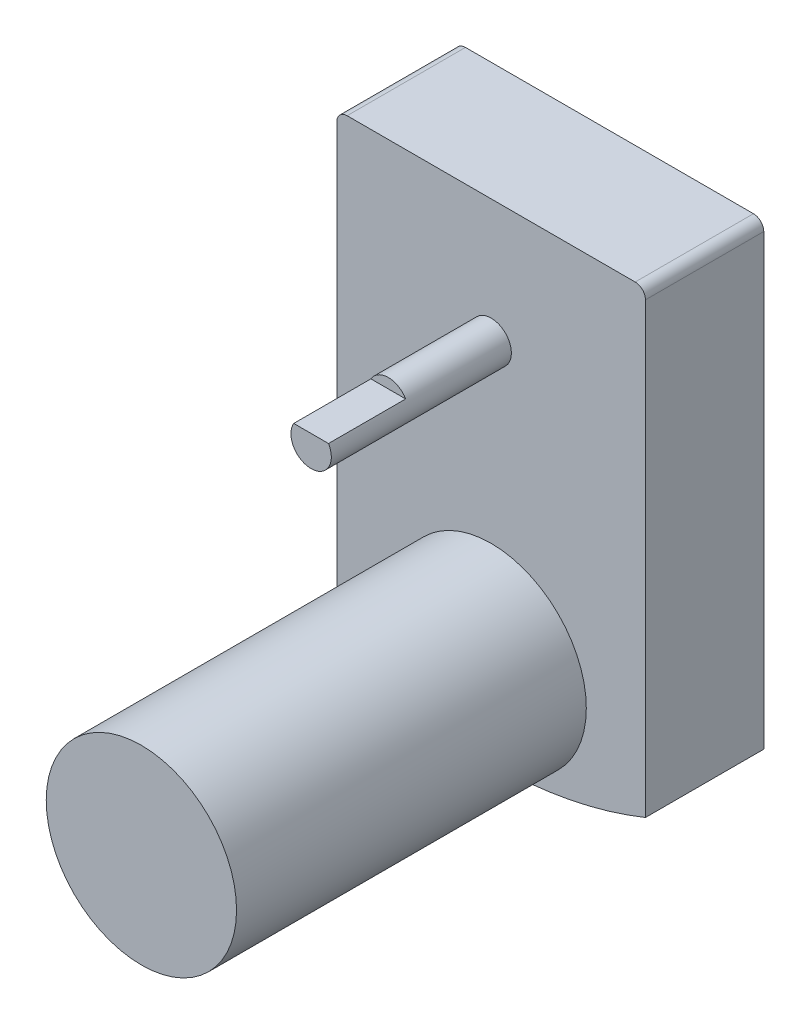
ISO-10303-21;
HEADER;
FILE_DESCRIPTION(('STEP AP214'),'2;1');
FILE_NAME('part.step','',(''),(''),'','','');
FILE_SCHEMA(('AUTOMOTIVE_DESIGN { 1 0 10303 214 1 1 1 1 }'));
ENDSEC;
DATA;
#1=APPLICATION_CONTEXT('core data for automotive mechanical design processes');
#2=APPLICATION_PROTOCOL_DEFINITION('international standard','automotive_design',2000,#1);
#3=PRODUCT_CONTEXT('',#1,'mechanical');
#4=PRODUCT('Part','Part','',(#3));
#5=PRODUCT_RELATED_PRODUCT_CATEGORY('part','',(#4));
#6=PRODUCT_DEFINITION_FORMATION('','',#4);
#7=PRODUCT_DEFINITION_CONTEXT('part definition',#1,'design');
#8=PRODUCT_DEFINITION('design','',#6,#7);
#9=PRODUCT_DEFINITION_SHAPE('','',#8);
#10=(LENGTH_UNIT() NAMED_UNIT(*) SI_UNIT(.MILLI.,.METRE.));
#11=(NAMED_UNIT(*) PLANE_ANGLE_UNIT() SI_UNIT($,.RADIAN.));
#12=(NAMED_UNIT(*) SI_UNIT($,.STERADIAN.) SOLID_ANGLE_UNIT());
#13=UNCERTAINTY_MEASURE_WITH_UNIT(LENGTH_MEASURE(1.E-05),#10,'distance_accuracy_value','');
#14=(GEOMETRIC_REPRESENTATION_CONTEXT(3) GLOBAL_UNCERTAINTY_ASSIGNED_CONTEXT((#13)) GLOBAL_UNIT_ASSIGNED_CONTEXT((#10,
#11,#12)) REPRESENTATION_CONTEXT('',''));
#15=CARTESIAN_POINT('',(0.,0.,0.));
#16=DIRECTION('',(0.,0.,1.));
#17=DIRECTION('',(1.,0.,0.));
#18=AXIS2_PLACEMENT_3D('',#15,#16,#17);
#19=CARTESIAN_POINT('',(0.,0.,23.));
#20=DIRECTION('',(0.,0.,1.));
#21=DIRECTION('',(1.,0.,0.));
#22=AXIS2_PLACEMENT_3D('',#19,#20,#21);
#23=PLANE('',#22);
#24=CARTESIAN_POINT('',(0.,23.5,23.));
#25=DIRECTION('',(0.,0.,1.));
#26=DIRECTION('',(1.,0.,0.));
#27=AXIS2_PLACEMENT_3D('',#24,#25,#26);
#28=CIRCLE('',#27,3.92796839095987);
#29=CARTESIAN_POINT('',(3.92796839095987,23.5,23.));
#30=VERTEX_POINT('',#29);
#31=EDGE_CURVE('E251',#30,#30,#28,.T.);
#32=ORIENTED_EDGE('',*,*,#31,.F.);
#33=EDGE_LOOP('',(#32));
#34=FACE_BOUND('',#33,.T.);
#35=CARTESIAN_POINT('',(0.,32.5,23.));
#36=DIRECTION('',(0.,0.,1.));
#37=DIRECTION('',(1.,0.,0.));
#38=AXIS2_PLACEMENT_3D('',#35,#36,#37);
#39=CIRCLE('',#38,80.);
#40=CARTESIAN_POINT('',(30.,-41.6619848709566,23.));
#41=VERTEX_POINT('',#40);
#42=CARTESIAN_POINT('',(0.,-47.5,23.));
#43=VERTEX_POINT('',#42);
#44=EDGE_CURVE('E121',#41,#43,#39,.F.);
#45=ORIENTED_EDGE('',*,*,#44,.F.);
#46=DIRECTION('',(0.,1.,0.));
#47=VECTOR('',#46,1.);
#48=CARTESIAN_POINT('',(30.,47.5,23.));
#49=LINE('',#48,#47);
#50=CARTESIAN_POINT('',(30.,45.5,23.));
#51=VERTEX_POINT('',#50);
#52=EDGE_CURVE('E66',#41,#51,#49,.T.);
#53=ORIENTED_EDGE('',*,*,#52,.T.);
#54=CARTESIAN_POINT('',(28.,45.5,23.));
#55=DIRECTION('',(0.,0.,1.));
#56=DIRECTION('',(1.,0.,0.));
#57=AXIS2_PLACEMENT_3D('',#54,#55,#56);
#58=CIRCLE('',#57,2.);
#59=CARTESIAN_POINT('',(28.,47.5,23.));
#60=VERTEX_POINT('',#59);
#61=EDGE_CURVE('E52',#51,#60,#58,.T.);
#62=ORIENTED_EDGE('',*,*,#61,.T.);
#63=DIRECTION('',(-1.,0.,0.));
#64=VECTOR('',#63,1.);
#65=CARTESIAN_POINT('',(-30.,47.5,23.));
#66=LINE('',#65,#64);
#67=CARTESIAN_POINT('',(-28.,47.5,23.));
#68=VERTEX_POINT('',#67);
#69=EDGE_CURVE('E133',#60,#68,#66,.T.);
#70=ORIENTED_EDGE('',*,*,#69,.T.);
#71=CARTESIAN_POINT('',(-28.,45.5,23.));
#72=DIRECTION('',(0.,0.,1.));
#73=DIRECTION('',(1.,0.,0.));
#74=AXIS2_PLACEMENT_3D('',#71,#72,#73);
#75=CIRCLE('',#74,2.);
#76=CARTESIAN_POINT('',(-30.,45.5,23.));
#77=VERTEX_POINT('',#76);
#78=EDGE_CURVE('E130',#68,#77,#75,.T.);
#79=ORIENTED_EDGE('',*,*,#78,.T.);
#80=DIRECTION('',(0.,-1.,0.));
#81=VECTOR('',#80,1.);
#82=CARTESIAN_POINT('',(-30.,47.5,23.));
#83=LINE('',#82,#81);
#84=CARTESIAN_POINT('',(-30.,-41.6619848709566,23.));
#85=VERTEX_POINT('',#84);
#86=EDGE_CURVE('E115',#77,#85,#83,.T.);
#87=ORIENTED_EDGE('',*,*,#86,.T.);
#88=EDGE_CURVE('E124',#43,#85,#39,.F.);
#89=ORIENTED_EDGE('',*,*,#88,.F.);
#90=CARTESIAN_POINT('',(0.,-29.,23.));
#91=DIRECTION('',(0.,0.,1.));
#92=DIRECTION('',(1.,0.,0.));
#93=AXIS2_PLACEMENT_3D('',#90,#91,#92);
#94=CIRCLE('',#93,18.5);
#95=EDGE_CURVE('E243',#43,#43,#94,.T.);
#96=ORIENTED_EDGE('',*,*,#95,.F.);
#97=EDGE_LOOP('',(#45,#53,#62,#70,#79,#87,#89,#96));
#98=FACE_BOUND('',#97,.T.);
#99=ADVANCED_FACE('F43',(#34,#98),#23,.T.);
#100=CARTESIAN_POINT('',(0.,0.,0.));
#101=DIRECTION('',(0.,0.,1.));
#102=DIRECTION('',(1.,0.,0.));
#103=AXIS2_PLACEMENT_3D('',#100,#101,#102);
#104=PLANE('',#103);
#105=CARTESIAN_POINT('',(19.9999999999996,-16.5,0.));
#106=DIRECTION('',(0.,0.,1.));
#107=DIRECTION('',(1.,0.,0.));
#108=AXIS2_PLACEMENT_3D('',#105,#106,#107);
#109=CIRCLE('',#108,4.);
#110=CARTESIAN_POINT('',(23.9999999999996,-16.5,0.));
#111=VERTEX_POINT('',#110);
#112=EDGE_CURVE('E166',#111,#111,#109,.F.);
#113=ORIENTED_EDGE('',*,*,#112,.F.);
#114=EDGE_LOOP('',(#113));
#115=FACE_BOUND('',#114,.T.);
#116=CARTESIAN_POINT('',(-20.0000000000004,-16.5,0.));
#117=DIRECTION('',(0.,0.,1.));
#118=DIRECTION('',(1.,0.,0.));
#119=AXIS2_PLACEMENT_3D('',#116,#117,#118);
#120=CIRCLE('',#119,4.);
#121=CARTESIAN_POINT('',(-16.0000000000004,-16.5,0.));
#122=VERTEX_POINT('',#121);
#123=EDGE_CURVE('E162',#122,#122,#120,.F.);
#124=ORIENTED_EDGE('',*,*,#123,.F.);
#125=EDGE_LOOP('',(#124));
#126=FACE_BOUND('',#125,.T.);
#127=CARTESIAN_POINT('',(20.,23.5,0.));
#128=DIRECTION('',(0.,0.,1.));
#129=DIRECTION('',(1.,0.,0.));
#130=AXIS2_PLACEMENT_3D('',#127,#128,#129);
#131=CIRCLE('',#130,4.);
#132=CARTESIAN_POINT('',(24.,23.5,0.));
#133=VERTEX_POINT('',#132);
#134=EDGE_CURVE('E158',#133,#133,#131,.F.);
#135=ORIENTED_EDGE('',*,*,#134,.F.);
#136=EDGE_LOOP('',(#135));
#137=FACE_BOUND('',#136,.T.);
#138=CARTESIAN_POINT('',(-20.,23.5,0.));
#139=DIRECTION('',(0.,0.,1.));
#140=DIRECTION('',(1.,0.,0.));
#141=AXIS2_PLACEMENT_3D('',#138,#139,#140);
#142=CIRCLE('',#141,4.);
#143=CARTESIAN_POINT('',(-16.,23.5,0.));
#144=VERTEX_POINT('',#143);
#145=EDGE_CURVE('E154',#144,#144,#142,.F.);
#146=ORIENTED_EDGE('',*,*,#145,.F.);
#147=EDGE_LOOP('',(#146));
#148=FACE_BOUND('',#147,.T.);
#149=DIRECTION('',(0.,1.,0.));
#150=VECTOR('',#149,1.);
#151=CARTESIAN_POINT('',(30.,47.5,0.));
#152=LINE('',#151,#150);
#153=CARTESIAN_POINT('',(30.,-41.6619848709566,0.));
#154=VERTEX_POINT('',#153);
#155=CARTESIAN_POINT('',(30.,45.5,0.));
#156=VERTEX_POINT('',#155);
#157=EDGE_CURVE('E142',#154,#156,#152,.T.);
#158=ORIENTED_EDGE('',*,*,#157,.F.);
#159=CARTESIAN_POINT('',(0.,32.5,0.));
#160=DIRECTION('',(0.,0.,1.));
#161=DIRECTION('',(1.,0.,0.));
#162=AXIS2_PLACEMENT_3D('',#159,#160,#161);
#163=CIRCLE('',#162,80.);
#164=CARTESIAN_POINT('',(-30.,-41.6619848709566,0.));
#165=VERTEX_POINT('',#164);
#166=EDGE_CURVE('E11',#154,#165,#163,.F.);
#167=ORIENTED_EDGE('',*,*,#166,.T.);
#168=DIRECTION('',(0.,-1.,0.));
#169=VECTOR('',#168,1.);
#170=CARTESIAN_POINT('',(-30.,47.5,0.));
#171=LINE('',#170,#169);
#172=CARTESIAN_POINT('',(-30.,45.5,0.));
#173=VERTEX_POINT('',#172);
#174=EDGE_CURVE('E118',#173,#165,#171,.T.);
#175=ORIENTED_EDGE('',*,*,#174,.F.);
#176=CARTESIAN_POINT('',(-28.,45.5,0.));
#177=DIRECTION('',(0.,0.,1.));
#178=DIRECTION('',(1.,0.,0.));
#179=AXIS2_PLACEMENT_3D('',#176,#177,#178);
#180=CIRCLE('',#179,2.);
#181=CARTESIAN_POINT('',(-28.,47.5,0.));
#182=VERTEX_POINT('',#181);
#183=EDGE_CURVE('E173',#173,#182,#180,.F.);
#184=ORIENTED_EDGE('',*,*,#183,.T.);
#185=DIRECTION('',(-1.,0.,0.));
#186=VECTOR('',#185,1.);
#187=CARTESIAN_POINT('',(-30.,47.5,0.));
#188=LINE('',#187,#186);
#189=CARTESIAN_POINT('',(28.,47.5,0.));
#190=VERTEX_POINT('',#189);
#191=EDGE_CURVE('E145',#190,#182,#188,.T.);
#192=ORIENTED_EDGE('',*,*,#191,.F.);
#193=CARTESIAN_POINT('',(28.,45.5,0.));
#194=DIRECTION('',(0.,0.,1.));
#195=DIRECTION('',(1.,0.,0.));
#196=AXIS2_PLACEMENT_3D('',#193,#194,#195);
#197=CIRCLE('',#196,2.);
#198=EDGE_CURVE('E187',#190,#156,#197,.F.);
#199=ORIENTED_EDGE('',*,*,#198,.T.);
#200=EDGE_LOOP('',(#158,#167,#175,#184,#192,#199));
#201=FACE_BOUND('',#200,.T.);
#202=ADVANCED_FACE('F205',(#115,#126,#137,#148,#201),#104,.F.);
#203=CARTESIAN_POINT('',(30.,47.5,23.));
#204=DIRECTION('',(-1.,0.,0.));
#205=DIRECTION('',(0.,-1.,0.));
#206=AXIS2_PLACEMENT_3D('',#203,#204,#205);
#207=PLANE('',#206);
#208=ORIENTED_EDGE('',*,*,#52,.F.);
#209=DIRECTION('',(0.,0.,-1.));
#210=VECTOR('',#209,1.);
#211=CARTESIAN_POINT('',(30.,-41.6619848709566,18.));
#212=LINE('',#211,#210);
#213=EDGE_CURVE('E120',#41,#154,#212,.T.);
#214=ORIENTED_EDGE('',*,*,#213,.T.);
#215=ORIENTED_EDGE('',*,*,#157,.T.);
#216=DIRECTION('',(0.,0.,-1.));
#217=VECTOR('',#216,1.);
#218=CARTESIAN_POINT('',(30.,45.5,23.));
#219=LINE('',#218,#217);
#220=EDGE_CURVE('E191',#156,#51,#219,.F.);
#221=ORIENTED_EDGE('',*,*,#220,.T.);
#222=EDGE_LOOP('',(#208,#214,#215,#221));
#223=FACE_BOUND('',#222,.T.);
#224=ADVANCED_FACE('F225',(#223),#207,.F.);
#225=CARTESIAN_POINT('',(-30.,47.5,23.));
#226=DIRECTION('',(0.,-1.,0.));
#227=DIRECTION('',(0.,0.,-1.));
#228=AXIS2_PLACEMENT_3D('',#225,#226,#227);
#229=PLANE('',#228);
#230=ORIENTED_EDGE('',*,*,#69,.F.);
#231=DIRECTION('',(0.,0.,-1.));
#232=VECTOR('',#231,1.);
#233=CARTESIAN_POINT('',(28.,47.5,23.));
#234=LINE('',#233,#232);
#235=EDGE_CURVE('E183',#60,#190,#234,.T.);
#236=ORIENTED_EDGE('',*,*,#235,.T.);
#237=ORIENTED_EDGE('',*,*,#191,.T.);
#238=DIRECTION('',(0.,0.,-1.));
#239=VECTOR('',#238,1.);
#240=CARTESIAN_POINT('',(-28.,47.5,23.));
#241=LINE('',#240,#239);
#242=EDGE_CURVE('E177',#182,#68,#241,.F.);
#243=ORIENTED_EDGE('',*,*,#242,.T.);
#244=EDGE_LOOP('',(#230,#236,#237,#243));
#245=FACE_BOUND('',#244,.T.);
#246=ADVANCED_FACE('F200',(#245),#229,.F.);
#247=CARTESIAN_POINT('',(-30.,47.5,23.));
#248=DIRECTION('',(1.,0.,0.));
#249=DIRECTION('',(0.,1.,0.));
#250=AXIS2_PLACEMENT_3D('',#247,#248,#249);
#251=PLANE('',#250);
#252=DIRECTION('',(0.,0.,-1.));
#253=VECTOR('',#252,1.);
#254=CARTESIAN_POINT('',(-30.,-41.6619848709566,18.));
#255=LINE('',#254,#253);
#256=EDGE_CURVE('E59',#165,#85,#255,.F.);
#257=ORIENTED_EDGE('',*,*,#256,.T.);
#258=ORIENTED_EDGE('',*,*,#86,.F.);
#259=DIRECTION('',(0.,0.,-1.));
#260=VECTOR('',#259,1.);
#261=CARTESIAN_POINT('',(-30.,45.5,23.));
#262=LINE('',#261,#260);
#263=EDGE_CURVE('E170',#77,#173,#262,.T.);
#264=ORIENTED_EDGE('',*,*,#263,.T.);
#265=ORIENTED_EDGE('',*,*,#174,.T.);
#266=EDGE_LOOP('',(#257,#258,#264,#265));
#267=FACE_BOUND('',#266,.T.);
#268=ADVANCED_FACE('F112',(#267),#251,.F.);
#269=CARTESIAN_POINT('',(0.,-29.,91.));
#270=DIRECTION('',(0.,0.,-1.));
#271=DIRECTION('',(-1.,0.,0.));
#272=AXIS2_PLACEMENT_3D('',#269,#270,#271);
#273=CYLINDRICAL_SURFACE('',#272,18.5);
#274=ORIENTED_EDGE('',*,*,#95,.T.);
#275=EDGE_LOOP('',(#274));
#276=FACE_BOUND('',#275,.T.);
#277=CARTESIAN_POINT('',(0.,-29.,91.));
#278=DIRECTION('',(0.,0.,1.));
#279=DIRECTION('',(1.,0.,0.));
#280=AXIS2_PLACEMENT_3D('',#277,#278,#279);
#281=CIRCLE('',#280,18.5);
#282=CARTESIAN_POINT('',(18.5,-29.,91.));
#283=VERTEX_POINT('',#282);
#284=EDGE_CURVE('E146',#283,#283,#281,.T.);
#285=ORIENTED_EDGE('',*,*,#284,.F.);
#286=EDGE_LOOP('',(#285));
#287=FACE_BOUND('',#286,.T.);
#288=ADVANCED_FACE('F230',(#276,#287),#273,.T.);
#289=CARTESIAN_POINT('',(0.,-29.,91.));
#290=DIRECTION('',(0.,0.,1.));
#291=DIRECTION('',(1.,0.,0.));
#292=AXIS2_PLACEMENT_3D('',#289,#290,#291);
#293=PLANE('',#292);
#294=ORIENTED_EDGE('',*,*,#284,.T.);
#295=EDGE_LOOP('',(#294));
#296=FACE_BOUND('',#295,.T.);
#297=ADVANCED_FACE('F367',(#296),#293,.T.);
#298=CARTESIAN_POINT('',(0.,23.5,58.));
#299=DIRECTION('',(0.,0.,-1.));
#300=DIRECTION('',(-1.,0.,0.));
#301=AXIS2_PLACEMENT_3D('',#298,#299,#300);
#302=CYLINDRICAL_SURFACE('',#301,3.92796839095987);
#303=CARTESIAN_POINT('',(0.,23.5,58.));
#304=DIRECTION('',(0.,0.,1.));
#305=DIRECTION('',(1.,0.,0.));
#306=AXIS2_PLACEMENT_3D('',#303,#304,#305);
#307=CIRCLE('',#306,3.92796839095987);
#308=CARTESIAN_POINT('',(-3.3806708920538,25.5,58.));
#309=VERTEX_POINT('',#308);
#310=CARTESIAN_POINT('',(3.3806708920538,25.5,58.));
#311=VERTEX_POINT('',#310);
#312=EDGE_CURVE('E247',#309,#311,#307,.T.);
#313=ORIENTED_EDGE('',*,*,#312,.F.);
#314=DIRECTION('',(0.,0.,-1.));
#315=VECTOR('',#314,1.);
#316=CARTESIAN_POINT('',(-3.3806708920538,25.5,58.));
#317=LINE('',#316,#315);
#318=CARTESIAN_POINT('',(-3.3806708920538,25.5,43.));
#319=VERTEX_POINT('',#318);
#320=EDGE_CURVE('E255',#309,#319,#317,.T.);
#321=ORIENTED_EDGE('',*,*,#320,.T.);
#322=CARTESIAN_POINT('',(0.,23.5,43.));
#323=DIRECTION('',(0.,0.,-1.));
#324=DIRECTION('',(-1.,0.,0.));
#325=AXIS2_PLACEMENT_3D('',#322,#323,#324);
#326=CIRCLE('',#325,3.92796839095987);
#327=CARTESIAN_POINT('',(3.3806708920538,25.5,43.));
#328=VERTEX_POINT('',#327);
#329=EDGE_CURVE('E137',#319,#328,#326,.T.);
#330=ORIENTED_EDGE('',*,*,#329,.T.);
#331=DIRECTION('',(0.,0.,-1.));
#332=VECTOR('',#331,1.);
#333=CARTESIAN_POINT('',(3.3806708920538,25.5,58.));
#334=LINE('',#333,#332);
#335=EDGE_CURVE('E262',#328,#311,#334,.F.);
#336=ORIENTED_EDGE('',*,*,#335,.T.);
#337=EDGE_LOOP('',(#313,#321,#330,#336));
#338=FACE_BOUND('',#337,.T.);
#339=ORIENTED_EDGE('',*,*,#31,.T.);
#340=EDGE_LOOP('',(#339));
#341=FACE_BOUND('',#340,.T.);
#342=ADVANCED_FACE('F364',(#338,#341),#302,.T.);
#343=CARTESIAN_POINT('',(0.,23.5,58.));
#344=DIRECTION('',(0.,0.,1.));
#345=DIRECTION('',(1.,0.,0.));
#346=AXIS2_PLACEMENT_3D('',#343,#344,#345);
#347=PLANE('',#346);
#348=DIRECTION('',(1.,0.,0.));
#349=VECTOR('',#348,1.);
#350=CARTESIAN_POINT('',(0.,25.5,58.));
#351=LINE('',#350,#349);
#352=EDGE_CURVE('E132',#309,#311,#351,.T.);
#353=ORIENTED_EDGE('',*,*,#352,.F.);
#354=ORIENTED_EDGE('',*,*,#312,.T.);
#355=EDGE_LOOP('',(#353,#354));
#356=FACE_BOUND('',#355,.T.);
#357=ADVANCED_FACE('F357',(#356),#347,.T.);
#358=CARTESIAN_POINT('',(0.,0.,43.));
#359=DIRECTION('',(0.,0.,-1.));
#360=DIRECTION('',(-1.,0.,0.));
#361=AXIS2_PLACEMENT_3D('',#358,#359,#360);
#362=PLANE('',#361);
#363=DIRECTION('',(1.,0.,0.));
#364=VECTOR('',#363,1.);
#365=CARTESIAN_POINT('',(-3.92796839095986,25.5,43.));
#366=LINE('',#365,#364);
#367=EDGE_CURVE('E266',#319,#328,#366,.T.);
#368=ORIENTED_EDGE('',*,*,#367,.T.);
#369=ORIENTED_EDGE('',*,*,#329,.F.);
#370=EDGE_LOOP('',(#368,#369));
#371=FACE_BOUND('',#370,.T.);
#372=ADVANCED_FACE('F354',(#371),#362,.F.);
#373=CARTESIAN_POINT('',(-3.92796839095986,25.5,43.));
#374=DIRECTION('',(0.,-1.,0.));
#375=DIRECTION('',(0.,0.,-1.));
#376=AXIS2_PLACEMENT_3D('',#373,#374,#375);
#377=PLANE('',#376);
#378=ORIENTED_EDGE('',*,*,#352,.T.);
#379=ORIENTED_EDGE('',*,*,#335,.F.);
#380=ORIENTED_EDGE('',*,*,#367,.F.);
#381=ORIENTED_EDGE('',*,*,#320,.F.);
#382=EDGE_LOOP('',(#378,#379,#380,#381));
#383=FACE_BOUND('',#382,.T.);
#384=ADVANCED_FACE('F349',(#383),#377,.F.);
#385=CARTESIAN_POINT('',(-20.,23.5,-5.));
#386=DIRECTION('',(0.,0.,-1.));
#387=DIRECTION('',(-1.,0.,0.));
#388=AXIS2_PLACEMENT_3D('',#385,#386,#387);
#389=PLANE('',#388);
#390=CARTESIAN_POINT('',(-20.,23.5,-5.));
#391=DIRECTION('',(0.,0.,-1.));
#392=DIRECTION('',(-1.,0.,0.));
#393=AXIS2_PLACEMENT_3D('',#390,#391,#392);
#394=CIRCLE('',#393,4.);
#395=CARTESIAN_POINT('',(-24.,23.5,-5.));
#396=VERTEX_POINT('',#395);
#397=EDGE_CURVE('E270',#396,#396,#394,.T.);
#398=ORIENTED_EDGE('',*,*,#397,.T.);
#399=EDGE_LOOP('',(#398));
#400=FACE_BOUND('',#399,.T.);
#401=CARTESIAN_POINT('',(-20.,23.5,-5.));
#402=DIRECTION('',(0.,0.,-1.));
#403=DIRECTION('',(-1.,0.,0.));
#404=AXIS2_PLACEMENT_3D('',#401,#402,#403);
#405=CIRCLE('',#404,2.);
#406=CARTESIAN_POINT('',(-22.,23.5,-5.));
#407=VERTEX_POINT('',#406);
#408=EDGE_CURVE('E274',#407,#407,#405,.T.);
#409=ORIENTED_EDGE('',*,*,#408,.F.);
#410=EDGE_LOOP('',(#409));
#411=FACE_BOUND('',#410,.T.);
#412=ADVANCED_FACE('F340',(#400,#411),#389,.T.);
#413=CARTESIAN_POINT('',(-20.,23.5,-5.));
#414=DIRECTION('',(0.,0.,1.));
#415=DIRECTION('',(1.,0.,0.));
#416=AXIS2_PLACEMENT_3D('',#413,#414,#415);
#417=CYLINDRICAL_SURFACE('',#416,4.);
#418=ORIENTED_EDGE('',*,*,#397,.F.);
#419=EDGE_LOOP('',(#418));
#420=FACE_BOUND('',#419,.T.);
#421=ORIENTED_EDGE('',*,*,#145,.T.);
#422=EDGE_LOOP('',(#421));
#423=FACE_BOUND('',#422,.T.);
#424=ADVANCED_FACE('F337',(#420,#423),#417,.T.);
#425=CARTESIAN_POINT('',(-20.,23.5,-5.));
#426=DIRECTION('',(0.,0.,1.));
#427=DIRECTION('',(1.,0.,0.));
#428=AXIS2_PLACEMENT_3D('',#425,#426,#427);
#429=CYLINDRICAL_SURFACE('',#428,2.);
#430=ORIENTED_EDGE('',*,*,#408,.T.);
#431=EDGE_LOOP('',(#430));
#432=FACE_BOUND('',#431,.T.);
#433=CARTESIAN_POINT('',(-20.,23.5,0.));
#434=DIRECTION('',(0.,0.,-1.));
#435=DIRECTION('',(-1.,0.,0.));
#436=AXIS2_PLACEMENT_3D('',#433,#434,#435);
#437=CIRCLE('',#436,2.);
#438=CARTESIAN_POINT('',(-22.,23.5,0.));
#439=VERTEX_POINT('',#438);
#440=EDGE_CURVE('E275',#439,#439,#437,.T.);
#441=ORIENTED_EDGE('',*,*,#440,.F.);
#442=EDGE_LOOP('',(#441));
#443=FACE_BOUND('',#442,.T.);
#444=ADVANCED_FACE('F339',(#432,#443),#429,.F.);
#445=ORIENTED_EDGE('',*,*,#440,.T.);
#446=EDGE_LOOP('',(#445));
#447=FACE_BOUND('',#446,.T.);
#448=ADVANCED_FACE('F227',(#447),#104,.F.);
#449=CARTESIAN_POINT('',(20.,23.5,-5.));
#450=DIRECTION('',(0.,0.,1.));
#451=DIRECTION('',(1.,0.,0.));
#452=AXIS2_PLACEMENT_3D('',#449,#450,#451);
#453=PLANE('',#452);
#454=CARTESIAN_POINT('',(20.,23.5,-5.));
#455=DIRECTION('',(0.,0.,-1.));
#456=DIRECTION('',(1.,0.,0.));
#457=AXIS2_PLACEMENT_3D('',#454,#455,#456);
#458=CIRCLE('',#457,4.);
#459=CARTESIAN_POINT('',(24.,23.5,-5.));
#460=VERTEX_POINT('',#459);
#461=EDGE_CURVE('E287',#460,#460,#458,.T.);
#462=ORIENTED_EDGE('',*,*,#461,.T.);
#463=EDGE_LOOP('',(#462));
#464=FACE_BOUND('',#463,.T.);
#465=CARTESIAN_POINT('',(20.,23.5,-5.));
#466=DIRECTION('',(0.,0.,-1.));
#467=DIRECTION('',(1.,0.,0.));
#468=AXIS2_PLACEMENT_3D('',#465,#466,#467);
#469=CIRCLE('',#468,2.);
#470=CARTESIAN_POINT('',(22.,23.5,-5.));
#471=VERTEX_POINT('',#470);
#472=EDGE_CURVE('E283',#471,#471,#469,.T.);
#473=ORIENTED_EDGE('',*,*,#472,.F.);
#474=EDGE_LOOP('',(#473));
#475=FACE_BOUND('',#474,.T.);
#476=ADVANCED_FACE('F468',(#464,#475),#453,.F.);
#477=CARTESIAN_POINT('',(20.,23.5,-5.));
#478=DIRECTION('',(0.,0.,1.));
#479=DIRECTION('',(1.,0.,0.));
#480=AXIS2_PLACEMENT_3D('',#477,#478,#479);
#481=CYLINDRICAL_SURFACE('',#480,4.);
#482=ORIENTED_EDGE('',*,*,#461,.F.);
#483=EDGE_LOOP('',(#482));
#484=FACE_BOUND('',#483,.T.);
#485=ORIENTED_EDGE('',*,*,#134,.T.);
#486=EDGE_LOOP('',(#485));
#487=FACE_BOUND('',#486,.T.);
#488=ADVANCED_FACE('F528',(#484,#487),#481,.T.);
#489=CARTESIAN_POINT('',(20.,23.5,-5.));
#490=DIRECTION('',(0.,0.,1.));
#491=DIRECTION('',(1.,0.,0.));
#492=AXIS2_PLACEMENT_3D('',#489,#490,#491);
#493=CYLINDRICAL_SURFACE('',#492,2.);
#494=ORIENTED_EDGE('',*,*,#472,.T.);
#495=EDGE_LOOP('',(#494));
#496=FACE_BOUND('',#495,.T.);
#497=CARTESIAN_POINT('',(20.,23.5,0.));
#498=DIRECTION('',(0.,0.,-1.));
#499=DIRECTION('',(1.,0.,0.));
#500=AXIS2_PLACEMENT_3D('',#497,#498,#499);
#501=CIRCLE('',#500,2.);
#502=CARTESIAN_POINT('',(22.,23.5,0.));
#503=VERTEX_POINT('',#502);
#504=EDGE_CURVE('E279',#503,#503,#501,.T.);
#505=ORIENTED_EDGE('',*,*,#504,.F.);
#506=EDGE_LOOP('',(#505));
#507=FACE_BOUND('',#506,.T.);
#508=ADVANCED_FACE('F482',(#496,#507),#493,.F.);
#509=ORIENTED_EDGE('',*,*,#504,.T.);
#510=EDGE_LOOP('',(#509));
#511=FACE_BOUND('',#510,.T.);
#512=ADVANCED_FACE('F470',(#511),#104,.F.);
#513=CARTESIAN_POINT('',(-20.0000000000004,-16.5,-5.));
#514=DIRECTION('',(0.,0.,-1.));
#515=DIRECTION('',(-1.,0.,0.));
#516=AXIS2_PLACEMENT_3D('',#513,#514,#515);
#517=PLANE('',#516);
#518=CARTESIAN_POINT('',(-20.0000000000004,-16.5,-5.));
#519=DIRECTION('',(0.,0.,-1.));
#520=DIRECTION('',(-1.,0.,0.));
#521=AXIS2_PLACEMENT_3D('',#518,#519,#520);
#522=CIRCLE('',#521,4.);
#523=CARTESIAN_POINT('',(-24.0000000000004,-16.5,-5.));
#524=VERTEX_POINT('',#523);
#525=EDGE_CURVE('E299',#524,#524,#522,.T.);
#526=ORIENTED_EDGE('',*,*,#525,.T.);
#527=EDGE_LOOP('',(#526));
#528=FACE_BOUND('',#527,.T.);
#529=CARTESIAN_POINT('',(-20.0000000000004,-16.5,-5.));
#530=DIRECTION('',(0.,0.,-1.));
#531=DIRECTION('',(-1.,0.,0.));
#532=AXIS2_PLACEMENT_3D('',#529,#530,#531);
#533=CIRCLE('',#532,2.);
#534=CARTESIAN_POINT('',(-22.0000000000004,-16.5,-5.));
#535=VERTEX_POINT('',#534);
#536=EDGE_CURVE('E295',#535,#535,#533,.T.);
#537=ORIENTED_EDGE('',*,*,#536,.F.);
#538=EDGE_LOOP('',(#537));
#539=FACE_BOUND('',#538,.T.);
#540=ADVANCED_FACE('F481',(#528,#539),#517,.T.);
#541=CARTESIAN_POINT('',(-20.0000000000004,-16.5,-5.));
#542=DIRECTION('',(0.,0.,1.));
#543=DIRECTION('',(1.,0.,0.));
#544=AXIS2_PLACEMENT_3D('',#541,#542,#543);
#545=CYLINDRICAL_SURFACE('',#544,4.);
#546=ORIENTED_EDGE('',*,*,#525,.F.);
#547=EDGE_LOOP('',(#546));
#548=FACE_BOUND('',#547,.T.);
#549=ORIENTED_EDGE('',*,*,#123,.T.);
#550=EDGE_LOOP('',(#549));
#551=FACE_BOUND('',#550,.T.);
#552=ADVANCED_FACE('F554',(#548,#551),#545,.T.);
#553=CARTESIAN_POINT('',(-20.0000000000004,-16.5,-5.));
#554=DIRECTION('',(0.,0.,1.));
#555=DIRECTION('',(1.,0.,0.));
#556=AXIS2_PLACEMENT_3D('',#553,#554,#555);
#557=CYLINDRICAL_SURFACE('',#556,2.);
#558=ORIENTED_EDGE('',*,*,#536,.T.);
#559=EDGE_LOOP('',(#558));
#560=FACE_BOUND('',#559,.T.);
#561=CARTESIAN_POINT('',(-20.0000000000004,-16.5,0.));
#562=DIRECTION('',(0.,0.,-1.));
#563=DIRECTION('',(-1.,0.,0.));
#564=AXIS2_PLACEMENT_3D('',#561,#562,#563);
#565=CIRCLE('',#564,2.);
#566=CARTESIAN_POINT('',(-22.0000000000004,-16.5,0.));
#567=VERTEX_POINT('',#566);
#568=EDGE_CURVE('E294',#567,#567,#565,.T.);
#569=ORIENTED_EDGE('',*,*,#568,.F.);
#570=EDGE_LOOP('',(#569));
#571=FACE_BOUND('',#570,.T.);
#572=ADVANCED_FACE('F494',(#560,#571),#557,.F.);
#573=ORIENTED_EDGE('',*,*,#568,.T.);
#574=EDGE_LOOP('',(#573));
#575=FACE_BOUND('',#574,.T.);
#576=ADVANCED_FACE('F217',(#575),#104,.F.);
#577=CARTESIAN_POINT('',(19.9999999999996,-16.5,-5.));
#578=DIRECTION('',(0.,0.,1.));
#579=DIRECTION('',(1.,0.,0.));
#580=AXIS2_PLACEMENT_3D('',#577,#578,#579);
#581=PLANE('',#580);
#582=CARTESIAN_POINT('',(19.9999999999996,-16.5,-5.));
#583=DIRECTION('',(0.,0.,-1.));
#584=DIRECTION('',(1.,0.,0.));
#585=AXIS2_PLACEMENT_3D('',#582,#583,#584);
#586=CIRCLE('',#585,4.);
#587=CARTESIAN_POINT('',(23.9999999999996,-16.5,-5.));
#588=VERTEX_POINT('',#587);
#589=EDGE_CURVE('E311',#588,#588,#586,.T.);
#590=ORIENTED_EDGE('',*,*,#589,.T.);
#591=EDGE_LOOP('',(#590));
#592=FACE_BOUND('',#591,.T.);
#593=CARTESIAN_POINT('',(19.9999999999996,-16.5,-5.));
#594=DIRECTION('',(0.,0.,-1.));
#595=DIRECTION('',(1.,0.,0.));
#596=AXIS2_PLACEMENT_3D('',#593,#594,#595);
#597=CIRCLE('',#596,2.);
#598=CARTESIAN_POINT('',(21.9999999999996,-16.5,-5.));
#599=VERTEX_POINT('',#598);
#600=EDGE_CURVE('E307',#599,#599,#597,.T.);
#601=ORIENTED_EDGE('',*,*,#600,.F.);
#602=EDGE_LOOP('',(#601));
#603=FACE_BOUND('',#602,.T.);
#604=ADVANCED_FACE('F322',(#592,#603),#581,.F.);
#605=CARTESIAN_POINT('',(19.9999999999996,-16.5,-5.));
#606=DIRECTION('',(0.,0.,1.));
#607=DIRECTION('',(1.,0.,0.));
#608=AXIS2_PLACEMENT_3D('',#605,#606,#607);
#609=CYLINDRICAL_SURFACE('',#608,4.);
#610=ORIENTED_EDGE('',*,*,#589,.F.);
#611=EDGE_LOOP('',(#610));
#612=FACE_BOUND('',#611,.T.);
#613=ORIENTED_EDGE('',*,*,#112,.T.);
#614=EDGE_LOOP('',(#613));
#615=FACE_BOUND('',#614,.T.);
#616=ADVANCED_FACE('F325',(#612,#615),#609,.T.);
#617=CARTESIAN_POINT('',(19.9999999999996,-16.5,-5.));
#618=DIRECTION('',(0.,0.,1.));
#619=DIRECTION('',(1.,0.,0.));
#620=AXIS2_PLACEMENT_3D('',#617,#618,#619);
#621=CYLINDRICAL_SURFACE('',#620,2.);
#622=ORIENTED_EDGE('',*,*,#600,.T.);
#623=EDGE_LOOP('',(#622));
#624=FACE_BOUND('',#623,.T.);
#625=CARTESIAN_POINT('',(19.9999999999996,-16.5,0.));
#626=DIRECTION('',(0.,0.,-1.));
#627=DIRECTION('',(1.,0.,0.));
#628=AXIS2_PLACEMENT_3D('',#625,#626,#627);
#629=CIRCLE('',#628,2.);
#630=CARTESIAN_POINT('',(21.9999999999996,-16.5,0.));
#631=VERTEX_POINT('',#630);
#632=EDGE_CURVE('E306',#631,#631,#629,.T.);
#633=ORIENTED_EDGE('',*,*,#632,.F.);
#634=EDGE_LOOP('',(#633));
#635=FACE_BOUND('',#634,.T.);
#636=ADVANCED_FACE('F214',(#624,#635),#621,.F.);
#637=ORIENTED_EDGE('',*,*,#632,.T.);
#638=EDGE_LOOP('',(#637));
#639=FACE_BOUND('',#638,.T.);
#640=ADVANCED_FACE('F209',(#639),#104,.F.);
#641=CARTESIAN_POINT('',(-28.,45.5,23.));
#642=DIRECTION('',(0.,0.,-1.));
#643=DIRECTION('',(-1.,0.,0.));
#644=AXIS2_PLACEMENT_3D('',#641,#642,#643);
#645=CYLINDRICAL_SURFACE('',#644,2.);
#646=ORIENTED_EDGE('',*,*,#78,.F.);
#647=ORIENTED_EDGE('',*,*,#242,.F.);
#648=ORIENTED_EDGE('',*,*,#183,.F.);
#649=ORIENTED_EDGE('',*,*,#263,.F.);
#650=EDGE_LOOP('',(#646,#647,#648,#649));
#651=FACE_BOUND('',#650,.T.);
#652=ADVANCED_FACE('F207',(#651),#645,.T.);
#653=CARTESIAN_POINT('',(28.,45.5,23.));
#654=DIRECTION('',(0.,0.,-1.));
#655=DIRECTION('',(-1.,0.,0.));
#656=AXIS2_PLACEMENT_3D('',#653,#654,#655);
#657=CYLINDRICAL_SURFACE('',#656,2.);
#658=ORIENTED_EDGE('',*,*,#61,.F.);
#659=ORIENTED_EDGE('',*,*,#220,.F.);
#660=ORIENTED_EDGE('',*,*,#198,.F.);
#661=ORIENTED_EDGE('',*,*,#235,.F.);
#662=EDGE_LOOP('',(#658,#659,#660,#661));
#663=FACE_BOUND('',#662,.T.);
#664=ADVANCED_FACE('F45',(#663),#657,.T.);
#665=CARTESIAN_POINT('',(0.,32.5,18.));
#666=DIRECTION('',(0.,0.,-1.));
#667=DIRECTION('',(-1.,0.,0.));
#668=AXIS2_PLACEMENT_3D('',#665,#666,#667);
#669=CYLINDRICAL_SURFACE('',#668,80.);
#670=ORIENTED_EDGE('',*,*,#44,.T.);
#671=ORIENTED_EDGE('',*,*,#88,.T.);
#672=ORIENTED_EDGE('',*,*,#256,.F.);
#673=ORIENTED_EDGE('',*,*,#166,.F.);
#674=ORIENTED_EDGE('',*,*,#213,.F.);
#675=EDGE_LOOP('',(#670,#671,#672,#673,#674));
#676=FACE_BOUND('',#675,.T.);
#677=ADVANCED_FACE('F125',(#676),#669,.T.);
#678=CLOSED_SHELL('',(#99,#202,#224,#246,#268,#288,#297,#342,#357,#372,#384,#412,#424,#444,#448,
#476,#488,#508,#512,#540,#552,#572,#576,#604,#616,#636,#640,#652,#664,#677));
#679=MANIFOLD_SOLID_BREP('B2',#678);
#680=ADVANCED_BREP_SHAPE_REPRESENTATION('',(#18,#679),#14);
#681=SHAPE_DEFINITION_REPRESENTATION(#9,#680);
ENDSEC;
END-ISO-10303-21;
